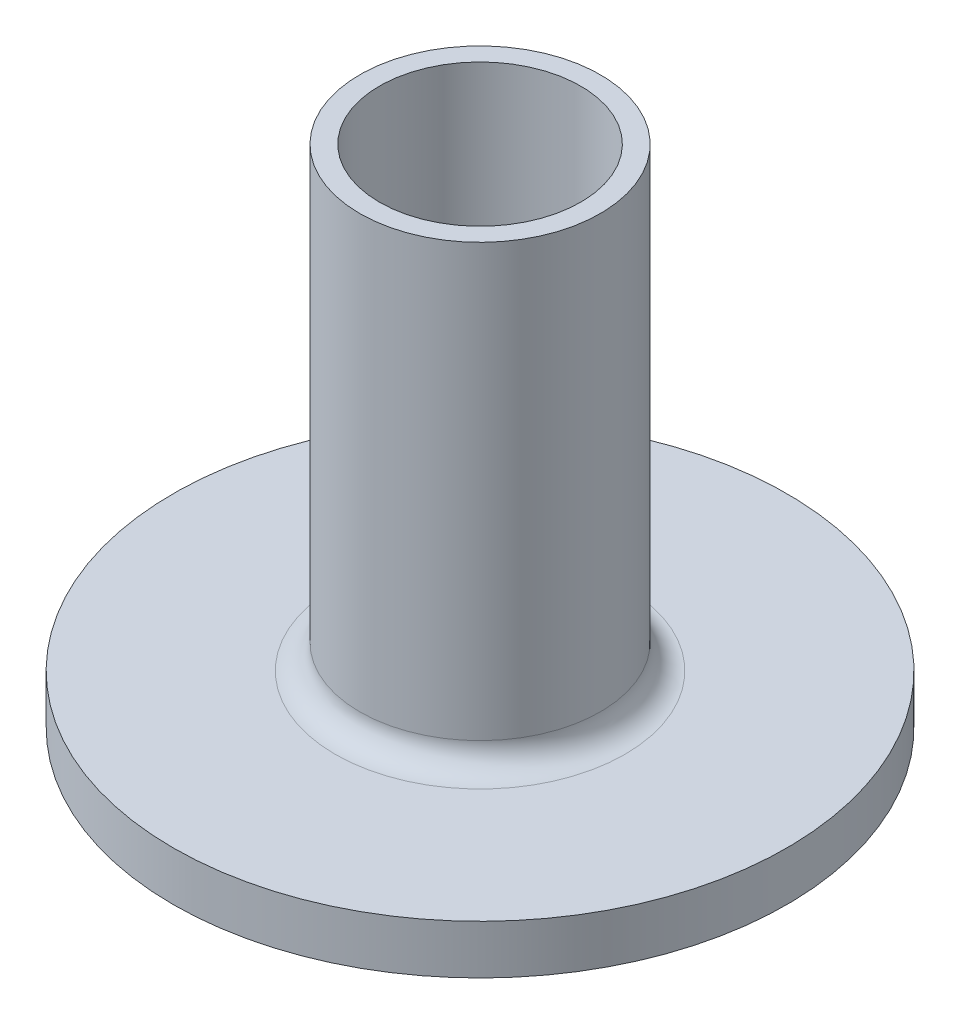
ISO-10303-21;
HEADER;
FILE_DESCRIPTION(('STEP AP214'),'2;1');
FILE_NAME('part.step','',(''),(''),'','','');
FILE_SCHEMA(('AUTOMOTIVE_DESIGN { 1 0 10303 214 1 1 1 1 }'));
ENDSEC;
DATA;
#1=APPLICATION_CONTEXT('core data for automotive mechanical design processes');
#2=APPLICATION_PROTOCOL_DEFINITION('international standard','automotive_design',2000,#1);
#3=PRODUCT_CONTEXT('',#1,'mechanical');
#4=PRODUCT('Part','Part','',(#3));
#5=PRODUCT_RELATED_PRODUCT_CATEGORY('part','',(#4));
#6=PRODUCT_DEFINITION_FORMATION('','',#4);
#7=PRODUCT_DEFINITION_CONTEXT('part definition',#1,'design');
#8=PRODUCT_DEFINITION('design','',#6,#7);
#9=PRODUCT_DEFINITION_SHAPE('','',#8);
#10=(LENGTH_UNIT() NAMED_UNIT(*) SI_UNIT(.MILLI.,.METRE.));
#11=(NAMED_UNIT(*) PLANE_ANGLE_UNIT() SI_UNIT($,.RADIAN.));
#12=(NAMED_UNIT(*) SI_UNIT($,.STERADIAN.) SOLID_ANGLE_UNIT());
#13=UNCERTAINTY_MEASURE_WITH_UNIT(LENGTH_MEASURE(1.E-05),#10,'distance_accuracy_value','');
#14=(GEOMETRIC_REPRESENTATION_CONTEXT(3) GLOBAL_UNCERTAINTY_ASSIGNED_CONTEXT((#13)) GLOBAL_UNIT_ASSIGNED_CONTEXT((#10,
#11,#12)) REPRESENTATION_CONTEXT('',''));
#15=CARTESIAN_POINT('',(0.,0.,0.));
#16=DIRECTION('',(0.,0.,1.));
#17=DIRECTION('',(1.,0.,0.));
#18=AXIS2_PLACEMENT_3D('',#15,#16,#17);
#19=CARTESIAN_POINT('',(0.,1.,0.));
#20=DIRECTION('',(0.,-1.,0.));
#21=DIRECTION('',(0.,0.,-1.));
#22=AXIS2_PLACEMENT_3D('',#19,#20,#21);
#23=CYLINDRICAL_SURFACE('',#22,6.25);
#24=CARTESIAN_POINT('',(0.,1.,0.));
#25=DIRECTION('',(0.,1.,0.));
#26=DIRECTION('',(0.,0.,1.));
#27=AXIS2_PLACEMENT_3D('',#24,#25,#26);
#28=CIRCLE('',#27,6.25);
#29=CARTESIAN_POINT('',(0.,1.,6.25));
#30=VERTEX_POINT('',#29);
#31=EDGE_CURVE('E49',#30,#30,#28,.T.);
#32=ORIENTED_EDGE('',*,*,#31,.F.);
#33=EDGE_LOOP('',(#32));
#34=FACE_BOUND('',#33,.T.);
#35=CARTESIAN_POINT('',(0.,0.,0.));
#36=DIRECTION('',(0.,1.,0.));
#37=DIRECTION('',(0.,0.,1.));
#38=AXIS2_PLACEMENT_3D('',#35,#36,#37);
#39=CIRCLE('',#38,6.25);
#40=CARTESIAN_POINT('',(0.,0.,6.25));
#41=VERTEX_POINT('',#40);
#42=EDGE_CURVE('E54',#41,#41,#39,.T.);
#43=ORIENTED_EDGE('',*,*,#42,.T.);
#44=EDGE_LOOP('',(#43));
#45=FACE_BOUND('',#44,.T.);
#46=ADVANCED_FACE('F36',(#34,#45),#23,.T.);
#47=CARTESIAN_POINT('',(0.,1.,0.));
#48=DIRECTION('',(0.,1.,0.));
#49=DIRECTION('',(0.,0.,1.));
#50=AXIS2_PLACEMENT_3D('',#47,#48,#49);
#51=PLANE('',#50);
#52=CARTESIAN_POINT('',(0.,1.,0.));
#53=DIRECTION('',(0.,1.,0.));
#54=DIRECTION('',(0.,0.,1.));
#55=AXIS2_PLACEMENT_3D('',#52,#53,#54);
#56=CIRCLE('',#55,2.95);
#57=CARTESIAN_POINT('',(0.,1.,2.95));
#58=VERTEX_POINT('',#57);
#59=EDGE_CURVE('E10',#58,#58,#56,.F.);
#60=ORIENTED_EDGE('',*,*,#59,.T.);
#61=EDGE_LOOP('',(#60));
#62=FACE_BOUND('',#61,.T.);
#63=ORIENTED_EDGE('',*,*,#31,.T.);
#64=EDGE_LOOP('',(#63));
#65=FACE_BOUND('',#64,.T.);
#66=ADVANCED_FACE('F96',(#62,#65),#51,.T.);
#67=CARTESIAN_POINT('',(0.,0.,0.));
#68=DIRECTION('',(0.,1.,0.));
#69=DIRECTION('',(0.,0.,1.));
#70=AXIS2_PLACEMENT_3D('',#67,#68,#69);
#71=PLANE('',#70);
#72=CARTESIAN_POINT('',(0.,0.,0.));
#73=DIRECTION('',(0.,1.,0.));
#74=DIRECTION('',(0.,0.,1.));
#75=AXIS2_PLACEMENT_3D('',#72,#73,#74);
#76=CIRCLE('',#75,2.05);
#77=CARTESIAN_POINT('',(0.,0.,2.05));
#78=VERTEX_POINT('',#77);
#79=EDGE_CURVE('E64',#78,#78,#76,.T.);
#80=ORIENTED_EDGE('',*,*,#79,.T.);
#81=EDGE_LOOP('',(#80));
#82=FACE_BOUND('',#81,.T.);
#83=ORIENTED_EDGE('',*,*,#42,.F.);
#84=EDGE_LOOP('',(#83));
#85=FACE_BOUND('',#84,.T.);
#86=ADVANCED_FACE('F73',(#82,#85),#71,.F.);
#87=CARTESIAN_POINT('',(0.,10.29,0.));
#88=DIRECTION('',(0.,-1.,0.));
#89=DIRECTION('',(0.,0.,-1.));
#90=AXIS2_PLACEMENT_3D('',#87,#88,#89);
#91=CYLINDRICAL_SURFACE('',#90,2.45);
#92=CARTESIAN_POINT('',(0.,1.5,0.));
#93=DIRECTION('',(0.,1.,0.));
#94=DIRECTION('',(0.,0.,1.));
#95=AXIS2_PLACEMENT_3D('',#92,#93,#94);
#96=CIRCLE('',#95,2.45);
#97=CARTESIAN_POINT('',(0.,1.5,2.45));
#98=VERTEX_POINT('',#97);
#99=EDGE_CURVE('E44',#98,#98,#96,.T.);
#100=ORIENTED_EDGE('',*,*,#99,.T.);
#101=EDGE_LOOP('',(#100));
#102=FACE_BOUND('',#101,.T.);
#103=CARTESIAN_POINT('',(0.,10.29,0.));
#104=DIRECTION('',(0.,1.,0.));
#105=DIRECTION('',(0.,0.,1.));
#106=AXIS2_PLACEMENT_3D('',#103,#104,#105);
#107=CIRCLE('',#106,2.45);
#108=CARTESIAN_POINT('',(0.,10.29,2.45));
#109=VERTEX_POINT('',#108);
#110=EDGE_CURVE('E59',#109,#109,#107,.T.);
#111=ORIENTED_EDGE('',*,*,#110,.F.);
#112=EDGE_LOOP('',(#111));
#113=FACE_BOUND('',#112,.T.);
#114=ADVANCED_FACE('F85',(#102,#113),#91,.T.);
#115=CARTESIAN_POINT('',(0.,10.29,0.));
#116=DIRECTION('',(0.,1.,0.));
#117=DIRECTION('',(0.,0.,1.));
#118=AXIS2_PLACEMENT_3D('',#115,#116,#117);
#119=PLANE('',#118);
#120=CARTESIAN_POINT('',(0.,10.29,0.));
#121=DIRECTION('',(0.,1.,0.));
#122=DIRECTION('',(0.,0.,1.));
#123=AXIS2_PLACEMENT_3D('',#120,#121,#122);
#124=CIRCLE('',#123,2.05);
#125=CARTESIAN_POINT('',(0.,10.29,2.05));
#126=VERTEX_POINT('',#125);
#127=EDGE_CURVE('E65',#126,#126,#124,.T.);
#128=ORIENTED_EDGE('',*,*,#127,.F.);
#129=EDGE_LOOP('',(#128));
#130=FACE_BOUND('',#129,.T.);
#131=ORIENTED_EDGE('',*,*,#110,.T.);
#132=EDGE_LOOP('',(#131));
#133=FACE_BOUND('',#132,.T.);
#134=ADVANCED_FACE('F79',(#130,#133),#119,.T.);
#135=CARTESIAN_POINT('',(0.,0.,0.));
#136=DIRECTION('',(0.,1.,0.));
#137=DIRECTION('',(0.,0.,1.));
#138=AXIS2_PLACEMENT_3D('',#135,#136,#137);
#139=CYLINDRICAL_SURFACE('',#138,2.05);
#140=ORIENTED_EDGE('',*,*,#79,.F.);
#141=EDGE_LOOP('',(#140));
#142=FACE_BOUND('',#141,.T.);
#143=ORIENTED_EDGE('',*,*,#127,.T.);
#144=EDGE_LOOP('',(#143));
#145=FACE_BOUND('',#144,.T.);
#146=ADVANCED_FACE('F76',(#142,#145),#139,.F.);
#147=CARTESIAN_POINT('',(0.,1.5,0.));
#148=DIRECTION('',(0.,1.,0.));
#149=DIRECTION('',(0.,0.,1.));
#150=AXIS2_PLACEMENT_3D('',#147,#148,#149);
#151=TOROIDAL_SURFACE('',#150,2.95,0.5);
#152=ORIENTED_EDGE('',*,*,#59,.F.);
#153=EDGE_LOOP('',(#152));
#154=FACE_BOUND('',#153,.T.);
#155=ORIENTED_EDGE('',*,*,#99,.F.);
#156=EDGE_LOOP('',(#155));
#157=FACE_BOUND('',#156,.T.);
#158=ADVANCED_FACE('F38',(#154,#157),#151,.F.);
#159=CLOSED_SHELL('',(#46,#66,#86,#114,#134,#146,#158));
#160=MANIFOLD_SOLID_BREP('B2',#159);
#161=ADVANCED_BREP_SHAPE_REPRESENTATION('',(#18,#160),#14);
#162=SHAPE_DEFINITION_REPRESENTATION(#9,#161);
ENDSEC;
END-ISO-10303-21;
